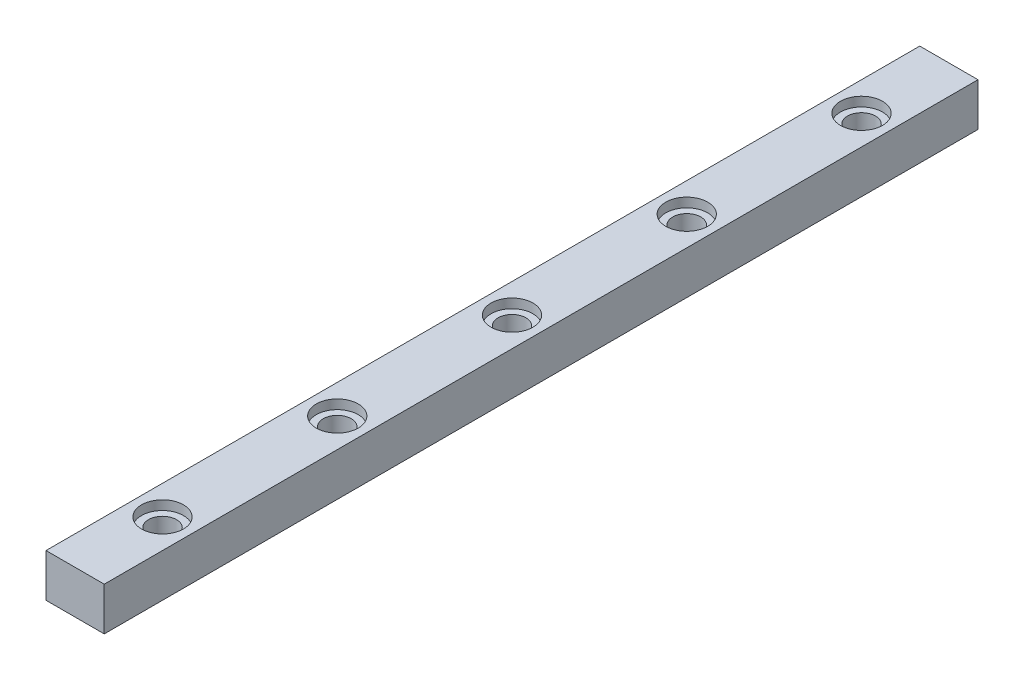
ISO-10303-21;
HEADER;
FILE_DESCRIPTION(('STEP AP214'),'2;1');
FILE_NAME('part.step','',(''),(''),'','','');
FILE_SCHEMA(('AUTOMOTIVE_DESIGN { 1 0 10303 214 1 1 1 1 }'));
ENDSEC;
DATA;
#1=APPLICATION_CONTEXT('core data for automotive mechanical design processes');
#2=APPLICATION_PROTOCOL_DEFINITION('international standard','automotive_design',2000,#1);
#3=PRODUCT_CONTEXT('',#1,'mechanical');
#4=PRODUCT('Part','Part','',(#3));
#5=PRODUCT_RELATED_PRODUCT_CATEGORY('part','',(#4));
#6=PRODUCT_DEFINITION_FORMATION('','',#4);
#7=PRODUCT_DEFINITION_CONTEXT('part definition',#1,'design');
#8=PRODUCT_DEFINITION('design','',#6,#7);
#9=PRODUCT_DEFINITION_SHAPE('','',#8);
#10=(LENGTH_UNIT() NAMED_UNIT(*) SI_UNIT(.MILLI.,.METRE.));
#11=(NAMED_UNIT(*) PLANE_ANGLE_UNIT() SI_UNIT($,.RADIAN.));
#12=(NAMED_UNIT(*) SI_UNIT($,.STERADIAN.) SOLID_ANGLE_UNIT());
#13=UNCERTAINTY_MEASURE_WITH_UNIT(LENGTH_MEASURE(1.E-05),#10,'distance_accuracy_value','');
#14=(GEOMETRIC_REPRESENTATION_CONTEXT(3) GLOBAL_UNCERTAINTY_ASSIGNED_CONTEXT((#13)) GLOBAL_UNIT_ASSIGNED_CONTEXT((#10,
#11,#12)) REPRESENTATION_CONTEXT('',''));
#15=CARTESIAN_POINT('',(0.,0.,0.));
#16=DIRECTION('',(0.,0.,1.));
#17=DIRECTION('',(1.,0.,0.));
#18=AXIS2_PLACEMENT_3D('',#15,#16,#17);
#19=CARTESIAN_POINT('',(0.,-3008.65,-30.));
#20=DIRECTION('',(0.,1.,0.));
#21=DIRECTION('',(0.,0.,1.));
#22=AXIS2_PLACEMENT_3D('',#19,#20,#21);
#23=CYLINDRICAL_SURFACE('',#22,1.2);
#24=CARTESIAN_POINT('',(0.,-1.85000000000013,-30.));
#25=DIRECTION('',(0.,1.,0.));
#26=DIRECTION('',(0.,0.,1.));
#27=AXIS2_PLACEMENT_3D('',#24,#25,#26);
#28=CIRCLE('',#27,1.2);
#29=CARTESIAN_POINT('',(0.,-1.85000000000013,-28.8));
#30=VERTEX_POINT('',#29);
#31=EDGE_CURVE('E119',#30,#30,#28,.T.);
#32=ORIENTED_EDGE('',*,*,#31,.F.);
#33=EDGE_LOOP('',(#32));
#34=FACE_BOUND('',#33,.T.);
#35=CARTESIAN_POINT('',(0.,1.05000000000022,-30.));
#36=DIRECTION('',(0.,1.,0.));
#37=DIRECTION('',(0.,0.,1.));
#38=AXIS2_PLACEMENT_3D('',#35,#36,#37);
#39=CIRCLE('',#38,1.2);
#40=CARTESIAN_POINT('',(0.,1.05000000000022,-28.8));
#41=VERTEX_POINT('',#40);
#42=EDGE_CURVE('E41',#41,#41,#39,.F.);
#43=ORIENTED_EDGE('',*,*,#42,.F.);
#44=EDGE_LOOP('',(#43));
#45=FACE_BOUND('',#44,.T.);
#46=ADVANCED_FACE('F37',(#34,#45),#23,.F.);
#47=CARTESIAN_POINT('',(0.,-3008.65,-15.));
#48=DIRECTION('',(0.,1.,0.));
#49=DIRECTION('',(0.,0.,1.));
#50=AXIS2_PLACEMENT_3D('',#47,#48,#49);
#51=CYLINDRICAL_SURFACE('',#50,1.2);
#52=CARTESIAN_POINT('',(0.,-1.85000000000013,-15.));
#53=DIRECTION('',(0.,1.,0.));
#54=DIRECTION('',(0.,0.,1.));
#55=AXIS2_PLACEMENT_3D('',#52,#53,#54);
#56=CIRCLE('',#55,1.2);
#57=CARTESIAN_POINT('',(0.,-1.85000000000013,-13.8));
#58=VERTEX_POINT('',#57);
#59=EDGE_CURVE('E122',#58,#58,#56,.T.);
#60=ORIENTED_EDGE('',*,*,#59,.F.);
#61=EDGE_LOOP('',(#60));
#62=FACE_BOUND('',#61,.T.);
#63=CARTESIAN_POINT('',(0.,1.05000000000022,-15.));
#64=DIRECTION('',(0.,1.,0.));
#65=DIRECTION('',(0.,0.,1.));
#66=AXIS2_PLACEMENT_3D('',#63,#64,#65);
#67=CIRCLE('',#66,1.2);
#68=CARTESIAN_POINT('',(0.,1.05000000000022,-13.8));
#69=VERTEX_POINT('',#68);
#70=EDGE_CURVE('E138',#69,#69,#67,.F.);
#71=ORIENTED_EDGE('',*,*,#70,.F.);
#72=EDGE_LOOP('',(#71));
#73=FACE_BOUND('',#72,.T.);
#74=ADVANCED_FACE('F148',(#62,#73),#51,.F.);
#75=CARTESIAN_POINT('',(0.,-3008.65,0.));
#76=DIRECTION('',(0.,1.,0.));
#77=DIRECTION('',(0.,0.,1.));
#78=AXIS2_PLACEMENT_3D('',#75,#76,#77);
#79=CYLINDRICAL_SURFACE('',#78,1.2);
#80=CARTESIAN_POINT('',(0.,-1.85000000000013,0.));
#81=DIRECTION('',(0.,1.,0.));
#82=DIRECTION('',(0.,0.,1.));
#83=AXIS2_PLACEMENT_3D('',#80,#81,#82);
#84=CIRCLE('',#83,1.2);
#85=CARTESIAN_POINT('',(0.,-1.85000000000013,1.2));
#86=VERTEX_POINT('',#85);
#87=EDGE_CURVE('E125',#86,#86,#84,.T.);
#88=ORIENTED_EDGE('',*,*,#87,.F.);
#89=EDGE_LOOP('',(#88));
#90=FACE_BOUND('',#89,.T.);
#91=CARTESIAN_POINT('',(0.,1.05000000000022,0.));
#92=DIRECTION('',(0.,1.,0.));
#93=DIRECTION('',(0.,0.,1.));
#94=AXIS2_PLACEMENT_3D('',#91,#92,#93);
#95=CIRCLE('',#94,1.2);
#96=CARTESIAN_POINT('',(0.,1.05000000000022,1.2));
#97=VERTEX_POINT('',#96);
#98=EDGE_CURVE('E135',#97,#97,#95,.F.);
#99=ORIENTED_EDGE('',*,*,#98,.F.);
#100=EDGE_LOOP('',(#99));
#101=FACE_BOUND('',#100,.T.);
#102=ADVANCED_FACE('F154',(#90,#101),#79,.F.);
#103=CARTESIAN_POINT('',(0.,-3008.65,15.));
#104=DIRECTION('',(0.,1.,0.));
#105=DIRECTION('',(0.,0.,1.));
#106=AXIS2_PLACEMENT_3D('',#103,#104,#105);
#107=CYLINDRICAL_SURFACE('',#106,1.2);
#108=CARTESIAN_POINT('',(0.,-1.85000000000013,15.));
#109=DIRECTION('',(0.,1.,0.));
#110=DIRECTION('',(0.,0.,1.));
#111=AXIS2_PLACEMENT_3D('',#108,#109,#110);
#112=CIRCLE('',#111,1.2);
#113=CARTESIAN_POINT('',(0.,-1.85000000000013,16.2));
#114=VERTEX_POINT('',#113);
#115=EDGE_CURVE('E128',#114,#114,#112,.T.);
#116=ORIENTED_EDGE('',*,*,#115,.F.);
#117=EDGE_LOOP('',(#116));
#118=FACE_BOUND('',#117,.T.);
#119=CARTESIAN_POINT('',(0.,1.05000000000022,15.));
#120=DIRECTION('',(0.,1.,0.));
#121=DIRECTION('',(0.,0.,1.));
#122=AXIS2_PLACEMENT_3D('',#119,#120,#121);
#123=CIRCLE('',#122,1.2);
#124=CARTESIAN_POINT('',(0.,1.05000000000022,16.2));
#125=VERTEX_POINT('',#124);
#126=EDGE_CURVE('E132',#125,#125,#123,.F.);
#127=ORIENTED_EDGE('',*,*,#126,.F.);
#128=EDGE_LOOP('',(#127));
#129=FACE_BOUND('',#128,.T.);
#130=ADVANCED_FACE('F173',(#118,#129),#107,.F.);
#131=CARTESIAN_POINT('',(0.,-3008.65,30.));
#132=DIRECTION('',(0.,1.,0.));
#133=DIRECTION('',(0.,0.,1.));
#134=AXIS2_PLACEMENT_3D('',#131,#132,#133);
#135=CYLINDRICAL_SURFACE('',#134,1.2);
#136=CARTESIAN_POINT('',(0.,-1.85000000000013,30.));
#137=DIRECTION('',(0.,1.,0.));
#138=DIRECTION('',(0.,0.,1.));
#139=AXIS2_PLACEMENT_3D('',#136,#137,#138);
#140=CIRCLE('',#139,1.2);
#141=CARTESIAN_POINT('',(0.,-1.85000000000013,31.2));
#142=VERTEX_POINT('',#141);
#143=EDGE_CURVE('E107',#142,#142,#140,.T.);
#144=ORIENTED_EDGE('',*,*,#143,.F.);
#145=EDGE_LOOP('',(#144));
#146=FACE_BOUND('',#145,.T.);
#147=CARTESIAN_POINT('',(0.,1.05000000000022,30.));
#148=DIRECTION('',(0.,1.,0.));
#149=DIRECTION('',(0.,0.,1.));
#150=AXIS2_PLACEMENT_3D('',#147,#148,#149);
#151=CIRCLE('',#150,1.2);
#152=CARTESIAN_POINT('',(0.,1.05000000000022,31.2));
#153=VERTEX_POINT('',#152);
#154=EDGE_CURVE('E115',#153,#153,#151,.F.);
#155=ORIENTED_EDGE('',*,*,#154,.F.);
#156=EDGE_LOOP('',(#155));
#157=FACE_BOUND('',#156,.T.);
#158=ADVANCED_FACE('F170',(#146,#157),#135,.F.);
#159=CARTESIAN_POINT('',(2.5,-1.85,37.5));
#160=DIRECTION('',(-1.,0.,0.));
#161=DIRECTION('',(0.,0.,1.));
#162=AXIS2_PLACEMENT_3D('',#159,#160,#161);
#163=PLANE('',#162);
#164=DIRECTION('',(0.,1.,0.));
#165=VECTOR('',#164,1.);
#166=CARTESIAN_POINT('',(2.5,-1.85,-37.5));
#167=LINE('',#166,#165);
#168=CARTESIAN_POINT('',(2.5,-1.85,-37.5));
#169=VERTEX_POINT('',#168);
#170=CARTESIAN_POINT('',(2.5,1.85,-37.5));
#171=VERTEX_POINT('',#170);
#172=EDGE_CURVE('E104',#169,#171,#167,.T.);
#173=ORIENTED_EDGE('',*,*,#172,.T.);
#174=DIRECTION('',(0.,0.,-1.));
#175=VECTOR('',#174,1.);
#176=CARTESIAN_POINT('',(2.5,1.85,37.5));
#177=LINE('',#176,#175);
#178=CARTESIAN_POINT('',(2.5,1.85,37.5));
#179=VERTEX_POINT('',#178);
#180=EDGE_CURVE('E11',#179,#171,#177,.T.);
#181=ORIENTED_EDGE('',*,*,#180,.F.);
#182=DIRECTION('',(0.,1.,0.));
#183=VECTOR('',#182,1.);
#184=CARTESIAN_POINT('',(2.5,-1.85,37.5));
#185=LINE('',#184,#183);
#186=CARTESIAN_POINT('',(2.5,-1.85,37.5));
#187=VERTEX_POINT('',#186);
#188=EDGE_CURVE('E91',#187,#179,#185,.T.);
#189=ORIENTED_EDGE('',*,*,#188,.F.);
#190=DIRECTION('',(0.,0.,-1.));
#191=VECTOR('',#190,1.);
#192=CARTESIAN_POINT('',(2.5,-1.85,37.5));
#193=LINE('',#192,#191);
#194=EDGE_CURVE('E100',#187,#169,#193,.T.);
#195=ORIENTED_EDGE('',*,*,#194,.T.);
#196=EDGE_LOOP('',(#173,#181,#189,#195));
#197=FACE_BOUND('',#196,.T.);
#198=ADVANCED_FACE('F39',(#197),#163,.F.);
#199=CARTESIAN_POINT('',(-2.5,1.85,37.5));
#200=DIRECTION('',(0.,-1.,0.));
#201=DIRECTION('',(0.,0.,-1.));
#202=AXIS2_PLACEMENT_3D('',#199,#200,#201);
#203=PLANE('',#202);
#204=CARTESIAN_POINT('',(0.,1.85,15.));
#205=DIRECTION('',(0.,1.,0.));
#206=DIRECTION('',(0.,0.,1.));
#207=AXIS2_PLACEMENT_3D('',#204,#205,#206);
#208=CIRCLE('',#207,1.8);
#209=CARTESIAN_POINT('',(0.,1.85,16.8));
#210=VERTEX_POINT('',#209);
#211=EDGE_CURVE('E194',#210,#210,#208,.T.);
#212=ORIENTED_EDGE('',*,*,#211,.F.);
#213=EDGE_LOOP('',(#212));
#214=FACE_BOUND('',#213,.T.);
#215=CARTESIAN_POINT('',(0.,1.85,0.));
#216=DIRECTION('',(0.,1.,0.));
#217=DIRECTION('',(0.,0.,1.));
#218=AXIS2_PLACEMENT_3D('',#215,#216,#217);
#219=CIRCLE('',#218,1.8);
#220=CARTESIAN_POINT('',(0.,1.85,1.8));
#221=VERTEX_POINT('',#220);
#222=EDGE_CURVE('E198',#221,#221,#219,.T.);
#223=ORIENTED_EDGE('',*,*,#222,.F.);
#224=EDGE_LOOP('',(#223));
#225=FACE_BOUND('',#224,.T.);
#226=CARTESIAN_POINT('',(0.,1.85,-15.));
#227=DIRECTION('',(0.,1.,0.));
#228=DIRECTION('',(0.,0.,1.));
#229=AXIS2_PLACEMENT_3D('',#226,#227,#228);
#230=CIRCLE('',#229,1.8);
#231=CARTESIAN_POINT('',(0.,1.85,-13.2));
#232=VERTEX_POINT('',#231);
#233=EDGE_CURVE('E202',#232,#232,#230,.T.);
#234=ORIENTED_EDGE('',*,*,#233,.F.);
#235=EDGE_LOOP('',(#234));
#236=FACE_BOUND('',#235,.T.);
#237=CARTESIAN_POINT('',(0.,1.85,-30.));
#238=DIRECTION('',(0.,1.,0.));
#239=DIRECTION('',(0.,0.,1.));
#240=AXIS2_PLACEMENT_3D('',#237,#238,#239);
#241=CIRCLE('',#240,1.8);
#242=CARTESIAN_POINT('',(0.,1.85,-28.2));
#243=VERTEX_POINT('',#242);
#244=EDGE_CURVE('E206',#243,#243,#241,.T.);
#245=ORIENTED_EDGE('',*,*,#244,.F.);
#246=EDGE_LOOP('',(#245));
#247=FACE_BOUND('',#246,.T.);
#248=CARTESIAN_POINT('',(0.,1.85,30.));
#249=DIRECTION('',(0.,1.,0.));
#250=DIRECTION('',(0.,0.,1.));
#251=AXIS2_PLACEMENT_3D('',#248,#249,#250);
#252=CIRCLE('',#251,1.8);
#253=CARTESIAN_POINT('',(0.,1.85,31.8));
#254=VERTEX_POINT('',#253);
#255=EDGE_CURVE('E131',#254,#254,#252,.T.);
#256=ORIENTED_EDGE('',*,*,#255,.F.);
#257=EDGE_LOOP('',(#256));
#258=FACE_BOUND('',#257,.T.);
#259=DIRECTION('',(-1.,0.,0.));
#260=VECTOR('',#259,1.);
#261=CARTESIAN_POINT('',(-2.5,1.85,-37.5));
#262=LINE('',#261,#260);
#263=CARTESIAN_POINT('',(-2.5,1.85,-37.5));
#264=VERTEX_POINT('',#263);
#265=EDGE_CURVE('E95',#171,#264,#262,.T.);
#266=ORIENTED_EDGE('',*,*,#265,.T.);
#267=DIRECTION('',(0.,0.,-1.));
#268=VECTOR('',#267,1.);
#269=CARTESIAN_POINT('',(-2.5,1.85,37.5));
#270=LINE('',#269,#268);
#271=CARTESIAN_POINT('',(-2.5,1.85,37.5));
#272=VERTEX_POINT('',#271);
#273=EDGE_CURVE('E47',#272,#264,#270,.T.);
#274=ORIENTED_EDGE('',*,*,#273,.F.);
#275=DIRECTION('',(-1.,0.,0.));
#276=VECTOR('',#275,1.);
#277=CARTESIAN_POINT('',(-2.5,1.85,37.5));
#278=LINE('',#277,#276);
#279=EDGE_CURVE('E86',#179,#272,#278,.T.);
#280=ORIENTED_EDGE('',*,*,#279,.F.);
#281=ORIENTED_EDGE('',*,*,#180,.T.);
#282=EDGE_LOOP('',(#266,#274,#280,#281));
#283=FACE_BOUND('',#282,.T.);
#284=ADVANCED_FACE('F94',(#214,#225,#236,#247,#258,#283),#203,.F.);
#285=CARTESIAN_POINT('',(-2.5,-1.85,37.5));
#286=DIRECTION('',(1.,0.,0.));
#287=DIRECTION('',(0.,0.,-1.));
#288=AXIS2_PLACEMENT_3D('',#285,#286,#287);
#289=PLANE('',#288);
#290=DIRECTION('',(0.,-1.,0.));
#291=VECTOR('',#290,1.);
#292=CARTESIAN_POINT('',(-2.5,-1.85,-37.5));
#293=LINE('',#292,#291);
#294=CARTESIAN_POINT('',(-2.5,-1.85,-37.5));
#295=VERTEX_POINT('',#294);
#296=EDGE_CURVE('E73',#264,#295,#293,.T.);
#297=ORIENTED_EDGE('',*,*,#296,.T.);
#298=DIRECTION('',(0.,0.,-1.));
#299=VECTOR('',#298,1.);
#300=CARTESIAN_POINT('',(-2.5,-1.85,37.5));
#301=LINE('',#300,#299);
#302=CARTESIAN_POINT('',(-2.5,-1.85,37.5));
#303=VERTEX_POINT('',#302);
#304=EDGE_CURVE('E96',#303,#295,#301,.T.);
#305=ORIENTED_EDGE('',*,*,#304,.F.);
#306=DIRECTION('',(0.,-1.,0.));
#307=VECTOR('',#306,1.);
#308=CARTESIAN_POINT('',(-2.5,-1.85,37.5));
#309=LINE('',#308,#307);
#310=EDGE_CURVE('E89',#272,#303,#309,.T.);
#311=ORIENTED_EDGE('',*,*,#310,.F.);
#312=ORIENTED_EDGE('',*,*,#273,.T.);
#313=EDGE_LOOP('',(#297,#305,#311,#312));
#314=FACE_BOUND('',#313,.T.);
#315=ADVANCED_FACE('F98',(#314),#289,.F.);
#316=CARTESIAN_POINT('',(-2.5,-1.85,37.5));
#317=DIRECTION('',(0.,1.,0.));
#318=DIRECTION('',(0.,0.,1.));
#319=AXIS2_PLACEMENT_3D('',#316,#317,#318);
#320=PLANE('',#319);
#321=ORIENTED_EDGE('',*,*,#115,.T.);
#322=EDGE_LOOP('',(#321));
#323=FACE_BOUND('',#322,.T.);
#324=ORIENTED_EDGE('',*,*,#87,.T.);
#325=EDGE_LOOP('',(#324));
#326=FACE_BOUND('',#325,.T.);
#327=ORIENTED_EDGE('',*,*,#59,.T.);
#328=EDGE_LOOP('',(#327));
#329=FACE_BOUND('',#328,.T.);
#330=ORIENTED_EDGE('',*,*,#31,.T.);
#331=EDGE_LOOP('',(#330));
#332=FACE_BOUND('',#331,.T.);
#333=ORIENTED_EDGE('',*,*,#143,.T.);
#334=EDGE_LOOP('',(#333));
#335=FACE_BOUND('',#334,.T.);
#336=DIRECTION('',(1.,0.,0.));
#337=VECTOR('',#336,1.);
#338=CARTESIAN_POINT('',(-2.5,-1.85,-37.5));
#339=LINE('',#338,#337);
#340=EDGE_CURVE('E79',#295,#169,#339,.T.);
#341=ORIENTED_EDGE('',*,*,#340,.T.);
#342=ORIENTED_EDGE('',*,*,#194,.F.);
#343=DIRECTION('',(1.,0.,0.));
#344=VECTOR('',#343,1.);
#345=CARTESIAN_POINT('',(-2.5,-1.85,37.5));
#346=LINE('',#345,#344);
#347=EDGE_CURVE('E56',#303,#187,#346,.T.);
#348=ORIENTED_EDGE('',*,*,#347,.F.);
#349=ORIENTED_EDGE('',*,*,#304,.T.);
#350=EDGE_LOOP('',(#341,#342,#348,#349));
#351=FACE_BOUND('',#350,.T.);
#352=ADVANCED_FACE('F177',(#323,#326,#329,#332,#335,#351),#320,.F.);
#353=CARTESIAN_POINT('',(0.,0.,37.5));
#354=DIRECTION('',(0.,0.,-1.));
#355=DIRECTION('',(-1.,0.,0.));
#356=AXIS2_PLACEMENT_3D('',#353,#354,#355);
#357=PLANE('',#356);
#358=ORIENTED_EDGE('',*,*,#188,.T.);
#359=ORIENTED_EDGE('',*,*,#279,.T.);
#360=ORIENTED_EDGE('',*,*,#310,.T.);
#361=ORIENTED_EDGE('',*,*,#347,.T.);
#362=EDGE_LOOP('',(#358,#359,#360,#361));
#363=FACE_BOUND('',#362,.T.);
#364=ADVANCED_FACE('F87',(#363),#357,.F.);
#365=CARTESIAN_POINT('',(0.,0.,-37.5));
#366=DIRECTION('',(0.,0.,-1.));
#367=DIRECTION('',(-1.,0.,0.));
#368=AXIS2_PLACEMENT_3D('',#365,#366,#367);
#369=PLANE('',#368);
#370=ORIENTED_EDGE('',*,*,#172,.F.);
#371=ORIENTED_EDGE('',*,*,#340,.F.);
#372=ORIENTED_EDGE('',*,*,#296,.F.);
#373=ORIENTED_EDGE('',*,*,#265,.F.);
#374=EDGE_LOOP('',(#370,#371,#372,#373));
#375=FACE_BOUND('',#374,.T.);
#376=ADVANCED_FACE('F164',(#375),#369,.T.);
#377=CARTESIAN_POINT('',(0.,1.05,30.));
#378=DIRECTION('',(0.,1.,0.));
#379=DIRECTION('',(0.,0.,1.));
#380=AXIS2_PLACEMENT_3D('',#377,#378,#379);
#381=PLANE('',#380);
#382=CARTESIAN_POINT('',(0.,1.05,30.));
#383=DIRECTION('',(0.,1.,0.));
#384=DIRECTION('',(0.,0.,1.));
#385=AXIS2_PLACEMENT_3D('',#382,#383,#384);
#386=CIRCLE('',#385,1.8);
#387=CARTESIAN_POINT('',(0.,1.05,31.8));
#388=VERTEX_POINT('',#387);
#389=EDGE_CURVE('E118',#388,#388,#386,.T.);
#390=ORIENTED_EDGE('',*,*,#389,.T.);
#391=EDGE_LOOP('',(#390));
#392=FACE_BOUND('',#391,.T.);
#393=ORIENTED_EDGE('',*,*,#154,.T.);
#394=EDGE_LOOP('',(#393));
#395=FACE_BOUND('',#394,.T.);
#396=ADVANCED_FACE('F160',(#392,#395),#381,.T.);
#397=CARTESIAN_POINT('',(0.,1.05,30.));
#398=DIRECTION('',(0.,1.,0.));
#399=DIRECTION('',(0.,0.,1.));
#400=AXIS2_PLACEMENT_3D('',#397,#398,#399);
#401=CYLINDRICAL_SURFACE('',#400,1.8);
#402=ORIENTED_EDGE('',*,*,#389,.F.);
#403=EDGE_LOOP('',(#402));
#404=FACE_BOUND('',#403,.T.);
#405=ORIENTED_EDGE('',*,*,#255,.T.);
#406=EDGE_LOOP('',(#405));
#407=FACE_BOUND('',#406,.T.);
#408=ADVANCED_FACE('F163',(#404,#407),#401,.F.);
#409=CARTESIAN_POINT('',(0.,1.05,15.));
#410=DIRECTION('',(0.,1.,0.));
#411=DIRECTION('',(0.,0.,1.));
#412=AXIS2_PLACEMENT_3D('',#409,#410,#411);
#413=PLANE('',#412);
#414=CARTESIAN_POINT('',(0.,1.05,15.));
#415=DIRECTION('',(0.,1.,0.));
#416=DIRECTION('',(0.,0.,1.));
#417=AXIS2_PLACEMENT_3D('',#414,#415,#416);
#418=CIRCLE('',#417,1.8);
#419=CARTESIAN_POINT('',(0.,1.05,16.8));
#420=VERTEX_POINT('',#419);
#421=EDGE_CURVE('E136',#420,#420,#418,.T.);
#422=ORIENTED_EDGE('',*,*,#421,.T.);
#423=EDGE_LOOP('',(#422));
#424=FACE_BOUND('',#423,.T.);
#425=ORIENTED_EDGE('',*,*,#126,.T.);
#426=EDGE_LOOP('',(#425));
#427=FACE_BOUND('',#426,.T.);
#428=ADVANCED_FACE('F168',(#424,#427),#413,.T.);
#429=CARTESIAN_POINT('',(0.,1.05,15.));
#430=DIRECTION('',(0.,1.,0.));
#431=DIRECTION('',(0.,0.,1.));
#432=AXIS2_PLACEMENT_3D('',#429,#430,#431);
#433=CYLINDRICAL_SURFACE('',#432,1.8);
#434=ORIENTED_EDGE('',*,*,#421,.F.);
#435=EDGE_LOOP('',(#434));
#436=FACE_BOUND('',#435,.T.);
#437=ORIENTED_EDGE('',*,*,#211,.T.);
#438=EDGE_LOOP('',(#437));
#439=FACE_BOUND('',#438,.T.);
#440=ADVANCED_FACE('F232',(#436,#439),#433,.F.);
#441=CARTESIAN_POINT('',(0.,1.05,0.));
#442=DIRECTION('',(0.,1.,0.));
#443=DIRECTION('',(0.,0.,1.));
#444=AXIS2_PLACEMENT_3D('',#441,#442,#443);
#445=PLANE('',#444);
#446=CARTESIAN_POINT('',(0.,1.05,0.));
#447=DIRECTION('',(0.,1.,0.));
#448=DIRECTION('',(0.,0.,1.));
#449=AXIS2_PLACEMENT_3D('',#446,#447,#448);
#450=CIRCLE('',#449,1.8);
#451=CARTESIAN_POINT('',(0.,1.05,1.8));
#452=VERTEX_POINT('',#451);
#453=EDGE_CURVE('E223',#452,#452,#450,.T.);
#454=ORIENTED_EDGE('',*,*,#453,.T.);
#455=EDGE_LOOP('',(#454));
#456=FACE_BOUND('',#455,.T.);
#457=ORIENTED_EDGE('',*,*,#98,.T.);
#458=EDGE_LOOP('',(#457));
#459=FACE_BOUND('',#458,.T.);
#460=ADVANCED_FACE('F235',(#456,#459),#445,.T.);
#461=CARTESIAN_POINT('',(0.,1.05,0.));
#462=DIRECTION('',(0.,1.,0.));
#463=DIRECTION('',(0.,0.,1.));
#464=AXIS2_PLACEMENT_3D('',#461,#462,#463);
#465=CYLINDRICAL_SURFACE('',#464,1.8);
#466=ORIENTED_EDGE('',*,*,#453,.F.);
#467=EDGE_LOOP('',(#466));
#468=FACE_BOUND('',#467,.T.);
#469=ORIENTED_EDGE('',*,*,#222,.T.);
#470=EDGE_LOOP('',(#469));
#471=FACE_BOUND('',#470,.T.);
#472=ADVANCED_FACE('F241',(#468,#471),#465,.F.);
#473=CARTESIAN_POINT('',(0.,1.05,-15.));
#474=DIRECTION('',(0.,1.,0.));
#475=DIRECTION('',(0.,0.,1.));
#476=AXIS2_PLACEMENT_3D('',#473,#474,#475);
#477=PLANE('',#476);
#478=CARTESIAN_POINT('',(0.,1.05,-15.));
#479=DIRECTION('',(0.,1.,0.));
#480=DIRECTION('',(0.,0.,1.));
#481=AXIS2_PLACEMENT_3D('',#478,#479,#480);
#482=CIRCLE('',#481,1.8);
#483=CARTESIAN_POINT('',(0.,1.05,-13.2));
#484=VERTEX_POINT('',#483);
#485=EDGE_CURVE('E219',#484,#484,#482,.T.);
#486=ORIENTED_EDGE('',*,*,#485,.T.);
#487=EDGE_LOOP('',(#486));
#488=FACE_BOUND('',#487,.T.);
#489=ORIENTED_EDGE('',*,*,#70,.T.);
#490=EDGE_LOOP('',(#489));
#491=FACE_BOUND('',#490,.T.);
#492=ADVANCED_FACE('F248',(#488,#491),#477,.T.);
#493=CARTESIAN_POINT('',(0.,1.05,-15.));
#494=DIRECTION('',(0.,1.,0.));
#495=DIRECTION('',(0.,0.,1.));
#496=AXIS2_PLACEMENT_3D('',#493,#494,#495);
#497=CYLINDRICAL_SURFACE('',#496,1.8);
#498=ORIENTED_EDGE('',*,*,#485,.F.);
#499=EDGE_LOOP('',(#498));
#500=FACE_BOUND('',#499,.T.);
#501=ORIENTED_EDGE('',*,*,#233,.T.);
#502=EDGE_LOOP('',(#501));
#503=FACE_BOUND('',#502,.T.);
#504=ADVANCED_FACE('F252',(#500,#503),#497,.F.);
#505=CARTESIAN_POINT('',(0.,1.05,-30.));
#506=DIRECTION('',(0.,1.,0.));
#507=DIRECTION('',(0.,0.,1.));
#508=AXIS2_PLACEMENT_3D('',#505,#506,#507);
#509=PLANE('',#508);
#510=CARTESIAN_POINT('',(0.,1.05,-30.));
#511=DIRECTION('',(0.,1.,0.));
#512=DIRECTION('',(0.,0.,1.));
#513=AXIS2_PLACEMENT_3D('',#510,#511,#512);
#514=CIRCLE('',#513,1.8);
#515=CARTESIAN_POINT('',(0.,1.05,-28.2));
#516=VERTEX_POINT('',#515);
#517=EDGE_CURVE('E215',#516,#516,#514,.T.);
#518=ORIENTED_EDGE('',*,*,#517,.T.);
#519=EDGE_LOOP('',(#518));
#520=FACE_BOUND('',#519,.T.);
#521=ORIENTED_EDGE('',*,*,#42,.T.);
#522=EDGE_LOOP('',(#521));
#523=FACE_BOUND('',#522,.T.);
#524=ADVANCED_FACE('F145',(#520,#523),#509,.T.);
#525=CARTESIAN_POINT('',(0.,1.05,-30.));
#526=DIRECTION('',(0.,1.,0.));
#527=DIRECTION('',(0.,0.,1.));
#528=AXIS2_PLACEMENT_3D('',#525,#526,#527);
#529=CYLINDRICAL_SURFACE('',#528,1.8);
#530=ORIENTED_EDGE('',*,*,#517,.F.);
#531=EDGE_LOOP('',(#530));
#532=FACE_BOUND('',#531,.T.);
#533=ORIENTED_EDGE('',*,*,#244,.T.);
#534=EDGE_LOOP('',(#533));
#535=FACE_BOUND('',#534,.T.);
#536=ADVANCED_FACE('F259',(#532,#535),#529,.F.);
#537=CLOSED_SHELL('',(#46,#74,#102,#130,#158,#198,#284,#315,#352,#364,#376,#396,#408,#428,#440,
#460,#472,#492,#504,#524,#536));
#538=MANIFOLD_SOLID_BREP('B2',#537);
#539=ADVANCED_BREP_SHAPE_REPRESENTATION('',(#18,#538),#14);
#540=SHAPE_DEFINITION_REPRESENTATION(#9,#539);
ENDSEC;
END-ISO-10303-21;
